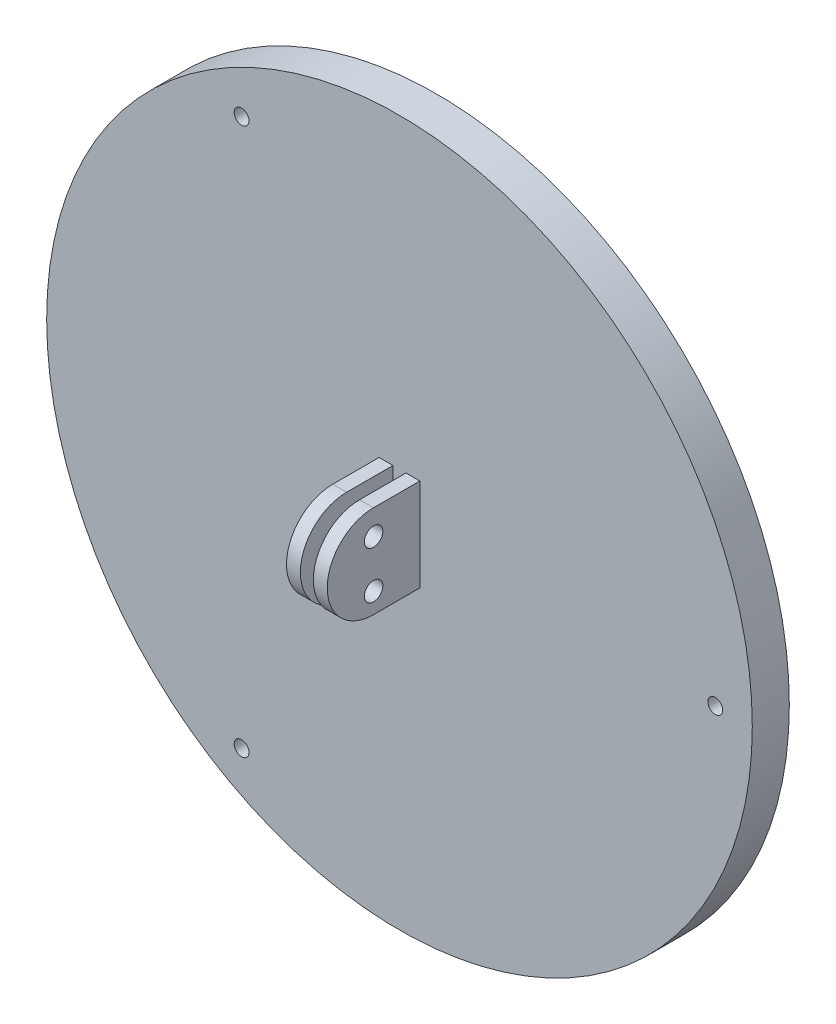
ISO-10303-21;
HEADER;
FILE_DESCRIPTION(('STEP AP214'),'2;1');
FILE_NAME('part.step','',(''),(''),'','','');
FILE_SCHEMA(('AUTOMOTIVE_DESIGN { 1 0 10303 214 1 1 1 1 }'));
ENDSEC;
DATA;
#1=APPLICATION_CONTEXT('core data for automotive mechanical design processes');
#2=APPLICATION_PROTOCOL_DEFINITION('international standard','automotive_design',2000,#1);
#3=PRODUCT_CONTEXT('',#1,'mechanical');
#4=PRODUCT('Part','Part','',(#3));
#5=PRODUCT_RELATED_PRODUCT_CATEGORY('part','',(#4));
#6=PRODUCT_DEFINITION_FORMATION('','',#4);
#7=PRODUCT_DEFINITION_CONTEXT('part definition',#1,'design');
#8=PRODUCT_DEFINITION('design','',#6,#7);
#9=PRODUCT_DEFINITION_SHAPE('','',#8);
#10=(LENGTH_UNIT() NAMED_UNIT(*) SI_UNIT(.MILLI.,.METRE.));
#11=(NAMED_UNIT(*) PLANE_ANGLE_UNIT() SI_UNIT($,.RADIAN.));
#12=(NAMED_UNIT(*) SI_UNIT($,.STERADIAN.) SOLID_ANGLE_UNIT());
#13=UNCERTAINTY_MEASURE_WITH_UNIT(LENGTH_MEASURE(1.E-05),#10,'distance_accuracy_value','');
#14=(GEOMETRIC_REPRESENTATION_CONTEXT(3) GLOBAL_UNCERTAINTY_ASSIGNED_CONTEXT((#13)) GLOBAL_UNIT_ASSIGNED_CONTEXT((#10,
#11,#12)) REPRESENTATION_CONTEXT('',''));
#15=CARTESIAN_POINT('',(0.,0.,0.));
#16=DIRECTION('',(0.,0.,1.));
#17=DIRECTION('',(1.,0.,0.));
#18=AXIS2_PLACEMENT_3D('',#15,#16,#17);
#19=CARTESIAN_POINT('',(0.699999999999999,5.,14.));
#20=DIRECTION('',(1.,0.,0.));
#21=DIRECTION('',(0.,1.,0.));
#22=AXIS2_PLACEMENT_3D('',#19,#20,#21);
#23=PLANE('',#22);
#24=CARTESIAN_POINT('',(0.699999999999999,2.3,9.));
#25=DIRECTION('',(1.,0.,0.));
#26=DIRECTION('',(0.,1.,0.));
#27=AXIS2_PLACEMENT_3D('',#24,#25,#26);
#28=CIRCLE('',#27,1.);
#29=CARTESIAN_POINT('',(0.699999999999999,3.3,9.));
#30=VERTEX_POINT('',#29);
#31=EDGE_CURVE('E127',#30,#30,#28,.T.);
#32=ORIENTED_EDGE('',*,*,#31,.T.);
#33=EDGE_LOOP('',(#32));
#34=FACE_BOUND('',#33,.T.);
#35=CARTESIAN_POINT('',(0.699999999999999,-2.8,9.));
#36=DIRECTION('',(1.,0.,0.));
#37=DIRECTION('',(0.,1.,0.));
#38=AXIS2_PLACEMENT_3D('',#35,#36,#37);
#39=CIRCLE('',#38,1.);
#40=CARTESIAN_POINT('',(0.699999999999999,-1.8,9.));
#41=VERTEX_POINT('',#40);
#42=EDGE_CURVE('E172',#41,#41,#39,.T.);
#43=ORIENTED_EDGE('',*,*,#42,.T.);
#44=EDGE_LOOP('',(#43));
#45=FACE_BOUND('',#44,.T.);
#46=DIRECTION('',(0.,0.,-1.));
#47=VECTOR('',#46,1.);
#48=CARTESIAN_POINT('',(0.7,-5.,14.));
#49=LINE('',#48,#47);
#50=CARTESIAN_POINT('',(0.699999999999999,-5.,9.));
#51=VERTEX_POINT('',#50);
#52=CARTESIAN_POINT('',(0.7,-5.,4.));
#53=VERTEX_POINT('',#52);
#54=EDGE_CURVE('E133',#51,#53,#49,.T.);
#55=ORIENTED_EDGE('',*,*,#54,.F.);
#56=CARTESIAN_POINT('',(0.699999999999999,0.,9.));
#57=DIRECTION('',(1.,0.,0.));
#58=DIRECTION('',(0.,1.,0.));
#59=AXIS2_PLACEMENT_3D('',#56,#57,#58);
#60=CIRCLE('',#59,5.);
#61=CARTESIAN_POINT('',(0.699999999999999,5.,9.));
#62=VERTEX_POINT('',#61);
#63=EDGE_CURVE('E124',#51,#62,#60,.F.);
#64=ORIENTED_EDGE('',*,*,#63,.T.);
#65=DIRECTION('',(0.,0.,-1.));
#66=VECTOR('',#65,1.);
#67=CARTESIAN_POINT('',(0.699999999999999,5.,14.));
#68=LINE('',#67,#66);
#69=CARTESIAN_POINT('',(0.699999999999999,5.,4.));
#70=VERTEX_POINT('',#69);
#71=EDGE_CURVE('E137',#62,#70,#68,.T.);
#72=ORIENTED_EDGE('',*,*,#71,.T.);
#73=DIRECTION('',(0.,-1.,0.));
#74=VECTOR('',#73,1.);
#75=CARTESIAN_POINT('',(0.699999999999999,5.,4.));
#76=LINE('',#75,#74);
#77=EDGE_CURVE('E214',#70,#53,#76,.T.);
#78=ORIENTED_EDGE('',*,*,#77,.T.);
#79=EDGE_LOOP('',(#55,#64,#72,#78));
#80=FACE_BOUND('',#79,.T.);
#81=ADVANCED_FACE('F41',(#34,#45,#80),#23,.F.);
#82=CARTESIAN_POINT('',(2.2,5.,14.));
#83=DIRECTION('',(-1.,0.,0.));
#84=DIRECTION('',(0.,0.,1.));
#85=AXIS2_PLACEMENT_3D('',#82,#83,#84);
#86=PLANE('',#85);
#87=CARTESIAN_POINT('',(2.2,2.3,9.));
#88=DIRECTION('',(1.,0.,0.));
#89=DIRECTION('',(0.,1.,0.));
#90=AXIS2_PLACEMENT_3D('',#87,#88,#89);
#91=CIRCLE('',#90,1.);
#92=CARTESIAN_POINT('',(2.2,3.3,9.));
#93=VERTEX_POINT('',#92);
#94=EDGE_CURVE('E168',#93,#93,#91,.T.);
#95=ORIENTED_EDGE('',*,*,#94,.F.);
#96=EDGE_LOOP('',(#95));
#97=FACE_BOUND('',#96,.T.);
#98=CARTESIAN_POINT('',(2.2,-2.8,9.));
#99=DIRECTION('',(1.,0.,0.));
#100=DIRECTION('',(0.,1.,0.));
#101=AXIS2_PLACEMENT_3D('',#98,#99,#100);
#102=CIRCLE('',#101,1.);
#103=CARTESIAN_POINT('',(2.2,-1.8,9.));
#104=VERTEX_POINT('',#103);
#105=EDGE_CURVE('E175',#104,#104,#102,.T.);
#106=ORIENTED_EDGE('',*,*,#105,.F.);
#107=EDGE_LOOP('',(#106));
#108=FACE_BOUND('',#107,.T.);
#109=CARTESIAN_POINT('',(2.2,0.,9.));
#110=DIRECTION('',(1.,0.,0.));
#111=DIRECTION('',(0.,1.,0.));
#112=AXIS2_PLACEMENT_3D('',#109,#110,#111);
#113=CIRCLE('',#112,5.);
#114=CARTESIAN_POINT('',(2.2,-5.,9.));
#115=VERTEX_POINT('',#114);
#116=CARTESIAN_POINT('',(2.2,5.,9.));
#117=VERTEX_POINT('',#116);
#118=EDGE_CURVE('E110',#115,#117,#113,.F.);
#119=ORIENTED_EDGE('',*,*,#118,.F.);
#120=DIRECTION('',(0.,0.,-1.));
#121=VECTOR('',#120,1.);
#122=CARTESIAN_POINT('',(2.2,-5.,14.));
#123=LINE('',#122,#121);
#124=CARTESIAN_POINT('',(2.2,-5.,4.));
#125=VERTEX_POINT('',#124);
#126=EDGE_CURVE('E114',#115,#125,#123,.T.);
#127=ORIENTED_EDGE('',*,*,#126,.T.);
#128=DIRECTION('',(0.,1.,0.));
#129=VECTOR('',#128,1.);
#130=CARTESIAN_POINT('',(2.2,5.,4.));
#131=LINE('',#130,#129);
#132=CARTESIAN_POINT('',(2.2,5.,4.));
#133=VERTEX_POINT('',#132);
#134=EDGE_CURVE('E218',#125,#133,#131,.T.);
#135=ORIENTED_EDGE('',*,*,#134,.T.);
#136=DIRECTION('',(0.,0.,-1.));
#137=VECTOR('',#136,1.);
#138=CARTESIAN_POINT('',(2.2,5.,14.));
#139=LINE('',#138,#137);
#140=EDGE_CURVE('E66',#117,#133,#139,.T.);
#141=ORIENTED_EDGE('',*,*,#140,.F.);
#142=EDGE_LOOP('',(#119,#127,#135,#141));
#143=FACE_BOUND('',#142,.T.);
#144=ADVANCED_FACE('F112',(#97,#108,#143),#86,.F.);
#145=CARTESIAN_POINT('',(-0.700000000000001,5.,14.));
#146=DIRECTION('',(-1.,0.,0.));
#147=DIRECTION('',(0.,-1.,0.));
#148=AXIS2_PLACEMENT_3D('',#145,#146,#147);
#149=PLANE('',#148);
#150=CARTESIAN_POINT('',(-0.699999999999999,2.3,9.));
#151=DIRECTION('',(-1.,0.,0.));
#152=DIRECTION('',(0.,-1.,0.));
#153=AXIS2_PLACEMENT_3D('',#150,#151,#152);
#154=CIRCLE('',#153,1.);
#155=CARTESIAN_POINT('',(-0.699999999999999,1.3,9.));
#156=VERTEX_POINT('',#155);
#157=EDGE_CURVE('E184',#156,#156,#154,.T.);
#158=ORIENTED_EDGE('',*,*,#157,.T.);
#159=EDGE_LOOP('',(#158));
#160=FACE_BOUND('',#159,.T.);
#161=CARTESIAN_POINT('',(-0.699999999999999,-2.8,9.));
#162=DIRECTION('',(-1.,0.,0.));
#163=DIRECTION('',(0.,-1.,0.));
#164=AXIS2_PLACEMENT_3D('',#161,#162,#163);
#165=CIRCLE('',#164,1.);
#166=CARTESIAN_POINT('',(-0.699999999999999,-3.8,9.));
#167=VERTEX_POINT('',#166);
#168=EDGE_CURVE('E167',#167,#167,#165,.T.);
#169=ORIENTED_EDGE('',*,*,#168,.T.);
#170=EDGE_LOOP('',(#169));
#171=FACE_BOUND('',#170,.T.);
#172=CARTESIAN_POINT('',(-0.699999999999999,0.,9.));
#173=DIRECTION('',(-1.,0.,0.));
#174=DIRECTION('',(0.,-1.,0.));
#175=AXIS2_PLACEMENT_3D('',#172,#173,#174);
#176=CIRCLE('',#175,5.);
#177=CARTESIAN_POINT('',(-0.699999999999999,5.,9.));
#178=VERTEX_POINT('',#177);
#179=CARTESIAN_POINT('',(-0.699999999999999,-5.,9.));
#180=VERTEX_POINT('',#179);
#181=EDGE_CURVE('E194',#178,#180,#176,.F.);
#182=ORIENTED_EDGE('',*,*,#181,.T.);
#183=DIRECTION('',(0.,0.,-1.));
#184=VECTOR('',#183,1.);
#185=CARTESIAN_POINT('',(-0.7,-5.,14.));
#186=LINE('',#185,#184);
#187=CARTESIAN_POINT('',(-0.7,-5.,4.));
#188=VERTEX_POINT('',#187);
#189=EDGE_CURVE('E202',#180,#188,#186,.T.);
#190=ORIENTED_EDGE('',*,*,#189,.T.);
#191=DIRECTION('',(0.,1.,0.));
#192=VECTOR('',#191,1.);
#193=CARTESIAN_POINT('',(-0.700000000000001,5.,4.));
#194=LINE('',#193,#192);
#195=CARTESIAN_POINT('',(-0.700000000000001,5.,4.));
#196=VERTEX_POINT('',#195);
#197=EDGE_CURVE('E211',#188,#196,#194,.T.);
#198=ORIENTED_EDGE('',*,*,#197,.T.);
#199=DIRECTION('',(0.,0.,-1.));
#200=VECTOR('',#199,1.);
#201=CARTESIAN_POINT('',(-0.700000000000001,5.,14.));
#202=LINE('',#201,#200);
#203=EDGE_CURVE('E197',#178,#196,#202,.T.);
#204=ORIENTED_EDGE('',*,*,#203,.F.);
#205=EDGE_LOOP('',(#182,#190,#198,#204));
#206=FACE_BOUND('',#205,.T.);
#207=ADVANCED_FACE('F242',(#160,#171,#206),#149,.F.);
#208=CARTESIAN_POINT('',(-2.2,5.,14.));
#209=DIRECTION('',(1.,0.,0.));
#210=DIRECTION('',(0.,1.,0.));
#211=AXIS2_PLACEMENT_3D('',#208,#209,#210);
#212=PLANE('',#211);
#213=CARTESIAN_POINT('',(-2.2,2.3,9.));
#214=DIRECTION('',(1.,0.,0.));
#215=DIRECTION('',(0.,1.,0.));
#216=AXIS2_PLACEMENT_3D('',#213,#214,#215);
#217=CIRCLE('',#216,1.);
#218=CARTESIAN_POINT('',(-2.2,3.3,9.));
#219=VERTEX_POINT('',#218);
#220=EDGE_CURVE('E45',#219,#219,#217,.T.);
#221=ORIENTED_EDGE('',*,*,#220,.T.);
#222=EDGE_LOOP('',(#221));
#223=FACE_BOUND('',#222,.T.);
#224=CARTESIAN_POINT('',(-2.2,-2.8,9.));
#225=DIRECTION('',(1.,0.,0.));
#226=DIRECTION('',(0.,1.,0.));
#227=AXIS2_PLACEMENT_3D('',#224,#225,#226);
#228=CIRCLE('',#227,1.);
#229=CARTESIAN_POINT('',(-2.2,-1.8,9.));
#230=VERTEX_POINT('',#229);
#231=EDGE_CURVE('E165',#230,#230,#228,.T.);
#232=ORIENTED_EDGE('',*,*,#231,.T.);
#233=EDGE_LOOP('',(#232));
#234=FACE_BOUND('',#233,.T.);
#235=DIRECTION('',(0.,0.,-1.));
#236=VECTOR('',#235,1.);
#237=CARTESIAN_POINT('',(-2.2,-5.,14.));
#238=LINE('',#237,#236);
#239=CARTESIAN_POINT('',(-2.2,-5.,9.));
#240=VERTEX_POINT('',#239);
#241=CARTESIAN_POINT('',(-2.2,-5.,4.));
#242=VERTEX_POINT('',#241);
#243=EDGE_CURVE('E58',#240,#242,#238,.T.);
#244=ORIENTED_EDGE('',*,*,#243,.F.);
#245=CARTESIAN_POINT('',(-2.2,0.,9.));
#246=DIRECTION('',(1.,0.,0.));
#247=DIRECTION('',(0.,1.,0.));
#248=AXIS2_PLACEMENT_3D('',#245,#246,#247);
#249=CIRCLE('',#248,5.);
#250=CARTESIAN_POINT('',(-2.2,5.,9.));
#251=VERTEX_POINT('',#250);
#252=EDGE_CURVE('E191',#240,#251,#249,.F.);
#253=ORIENTED_EDGE('',*,*,#252,.T.);
#254=DIRECTION('',(0.,0.,-1.));
#255=VECTOR('',#254,1.);
#256=CARTESIAN_POINT('',(-2.2,5.,14.));
#257=LINE('',#256,#255);
#258=CARTESIAN_POINT('',(-2.2,5.,4.));
#259=VERTEX_POINT('',#258);
#260=EDGE_CURVE('E199',#251,#259,#257,.T.);
#261=ORIENTED_EDGE('',*,*,#260,.T.);
#262=DIRECTION('',(0.,-1.,0.));
#263=VECTOR('',#262,1.);
#264=CARTESIAN_POINT('',(-2.2,5.,4.));
#265=LINE('',#264,#263);
#266=EDGE_CURVE('E206',#259,#242,#265,.T.);
#267=ORIENTED_EDGE('',*,*,#266,.T.);
#268=EDGE_LOOP('',(#244,#253,#261,#267));
#269=FACE_BOUND('',#268,.T.);
#270=ADVANCED_FACE('F327',(#223,#234,#269),#212,.F.);
#271=CARTESIAN_POINT('',(0.699999999999999,5.,14.));
#272=DIRECTION('',(0.,-1.,0.));
#273=DIRECTION('',(0.,0.,-1.));
#274=AXIS2_PLACEMENT_3D('',#271,#272,#273);
#275=PLANE('',#274);
#276=DIRECTION('',(1.,0.,0.));
#277=VECTOR('',#276,1.);
#278=CARTESIAN_POINT('',(-38.1,4.99999999999999,9.));
#279=LINE('',#278,#277);
#280=EDGE_CURVE('E117',#62,#117,#279,.T.);
#281=ORIENTED_EDGE('',*,*,#280,.T.);
#282=ORIENTED_EDGE('',*,*,#140,.T.);
#283=DIRECTION('',(-1.,0.,0.));
#284=VECTOR('',#283,1.);
#285=CARTESIAN_POINT('',(0.699999999999999,5.,4.));
#286=LINE('',#285,#284);
#287=EDGE_CURVE('E220',#133,#70,#286,.T.);
#288=ORIENTED_EDGE('',*,*,#287,.T.);
#289=ORIENTED_EDGE('',*,*,#71,.F.);
#290=EDGE_LOOP('',(#281,#282,#288,#289));
#291=FACE_BOUND('',#290,.T.);
#292=ADVANCED_FACE('F225',(#291),#275,.F.);
#293=CARTESIAN_POINT('',(-0.700000000000001,5.,14.));
#294=DIRECTION('',(0.,-1.,0.));
#295=DIRECTION('',(0.,0.,-1.));
#296=AXIS2_PLACEMENT_3D('',#293,#294,#295);
#297=PLANE('',#296);
#298=EDGE_CURVE('E190',#251,#178,#279,.T.);
#299=ORIENTED_EDGE('',*,*,#298,.T.);
#300=ORIENTED_EDGE('',*,*,#203,.T.);
#301=DIRECTION('',(-1.,0.,0.));
#302=VECTOR('',#301,1.);
#303=CARTESIAN_POINT('',(-0.700000000000001,5.,4.));
#304=LINE('',#303,#302);
#305=EDGE_CURVE('E208',#196,#259,#304,.T.);
#306=ORIENTED_EDGE('',*,*,#305,.T.);
#307=ORIENTED_EDGE('',*,*,#260,.F.);
#308=EDGE_LOOP('',(#299,#300,#306,#307));
#309=FACE_BOUND('',#308,.T.);
#310=ADVANCED_FACE('F230',(#309),#297,.F.);
#311=CARTESIAN_POINT('',(0.,0.,4.));
#312=DIRECTION('',(0.,0.,1.));
#313=DIRECTION('',(1.,0.,0.));
#314=AXIS2_PLACEMENT_3D('',#311,#312,#313);
#315=PLANE('',#314);
#316=CARTESIAN_POINT('',(0.,0.,4.));
#317=DIRECTION('',(0.,0.,1.));
#318=DIRECTION('',(1.,0.,0.));
#319=AXIS2_PLACEMENT_3D('',#316,#317,#318);
#320=CIRCLE('',#319,0.6);
#321=CARTESIAN_POINT('',(0.6,0.,4.));
#322=VERTEX_POINT('',#321);
#323=EDGE_CURVE('E135',#322,#322,#320,.T.);
#324=ORIENTED_EDGE('',*,*,#323,.F.);
#325=EDGE_LOOP('',(#324));
#326=FACE_BOUND('',#325,.T.);
#327=CARTESIAN_POINT('',(34.1000000000013,-0.0857218150126376,4.));
#328=DIRECTION('',(0.,0.,1.));
#329=DIRECTION('',(1.,0.,0.));
#330=AXIS2_PLACEMENT_3D('',#327,#328,#329);
#331=CIRCLE('',#330,0.800000000000003);
#332=CARTESIAN_POINT('',(34.9000000000013,-0.0857218150126376,4.));
#333=VERTEX_POINT('',#332);
#334=EDGE_CURVE('E144',#333,#333,#331,.T.);
#335=ORIENTED_EDGE('',*,*,#334,.F.);
#336=EDGE_LOOP('',(#335));
#337=FACE_BOUND('',#336,.T.);
#338=CARTESIAN_POINT('',(-17.0499999999986,-29.617188084062,4.));
#339=DIRECTION('',(0.,0.,1.));
#340=DIRECTION('',(1.,0.,0.));
#341=AXIS2_PLACEMENT_3D('',#338,#339,#340);
#342=CIRCLE('',#341,0.799999999999999);
#343=CARTESIAN_POINT('',(-16.2499999999986,-29.617188084062,4.));
#344=VERTEX_POINT('',#343);
#345=EDGE_CURVE('E148',#344,#344,#342,.T.);
#346=ORIENTED_EDGE('',*,*,#345,.F.);
#347=EDGE_LOOP('',(#346));
#348=FACE_BOUND('',#347,.T.);
#349=CARTESIAN_POINT('',(-17.0499999999987,29.4457444540367,4.));
#350=DIRECTION('',(0.,0.,1.));
#351=DIRECTION('',(1.,0.,0.));
#352=AXIS2_PLACEMENT_3D('',#349,#350,#351);
#353=CIRCLE('',#352,0.799999999999999);
#354=CARTESIAN_POINT('',(-16.2499999999986,29.4457444540367,4.));
#355=VERTEX_POINT('',#354);
#356=EDGE_CURVE('E151',#355,#355,#353,.T.);
#357=ORIENTED_EDGE('',*,*,#356,.F.);
#358=EDGE_LOOP('',(#357));
#359=FACE_BOUND('',#358,.T.);
#360=CARTESIAN_POINT('',(0.,0.,4.));
#361=DIRECTION('',(0.,0.,1.));
#362=DIRECTION('',(1.,0.,0.));
#363=AXIS2_PLACEMENT_3D('',#360,#361,#362);
#364=CIRCLE('',#363,38.1);
#365=CARTESIAN_POINT('',(38.1,0.,4.));
#366=VERTEX_POINT('',#365);
#367=EDGE_CURVE('E11',#366,#366,#364,.T.);
#368=ORIENTED_EDGE('',*,*,#367,.T.);
#369=EDGE_LOOP('',(#368));
#370=FACE_BOUND('',#369,.T.);
#371=DIRECTION('',(1.,0.,0.));
#372=VECTOR('',#371,1.);
#373=CARTESIAN_POINT('',(0.7,-5.,4.));
#374=LINE('',#373,#372);
#375=EDGE_CURVE('E131',#53,#125,#374,.T.);
#376=ORIENTED_EDGE('',*,*,#375,.F.);
#377=ORIENTED_EDGE('',*,*,#77,.F.);
#378=ORIENTED_EDGE('',*,*,#287,.F.);
#379=ORIENTED_EDGE('',*,*,#134,.F.);
#380=EDGE_LOOP('',(#376,#377,#378,#379));
#381=FACE_BOUND('',#380,.T.);
#382=ORIENTED_EDGE('',*,*,#305,.F.);
#383=ORIENTED_EDGE('',*,*,#197,.F.);
#384=DIRECTION('',(1.,0.,0.));
#385=VECTOR('',#384,1.);
#386=CARTESIAN_POINT('',(-0.7,-5.,4.));
#387=LINE('',#386,#385);
#388=EDGE_CURVE('E204',#242,#188,#387,.T.);
#389=ORIENTED_EDGE('',*,*,#388,.F.);
#390=ORIENTED_EDGE('',*,*,#266,.F.);
#391=EDGE_LOOP('',(#382,#383,#389,#390));
#392=FACE_BOUND('',#391,.T.);
#393=ADVANCED_FACE('F227',(#326,#337,#348,#359,#370,#381,#392),#315,.T.);
#394=CARTESIAN_POINT('',(0.,0.,4.));
#395=DIRECTION('',(0.,0.,-1.));
#396=DIRECTION('',(-1.,0.,0.));
#397=AXIS2_PLACEMENT_3D('',#394,#395,#396);
#398=CYLINDRICAL_SURFACE('',#397,38.1);
#399=ORIENTED_EDGE('',*,*,#367,.F.);
#400=EDGE_LOOP('',(#399));
#401=FACE_BOUND('',#400,.T.);
#402=CARTESIAN_POINT('',(0.,0.,0.));
#403=DIRECTION('',(0.,0.,1.));
#404=DIRECTION('',(1.,0.,0.));
#405=AXIS2_PLACEMENT_3D('',#402,#403,#404);
#406=CIRCLE('',#405,38.1);
#407=CARTESIAN_POINT('',(38.1,0.,0.));
#408=VERTEX_POINT('',#407);
#409=EDGE_CURVE('E50',#408,#408,#406,.T.);
#410=ORIENTED_EDGE('',*,*,#409,.T.);
#411=EDGE_LOOP('',(#410));
#412=FACE_BOUND('',#411,.T.);
#413=ADVANCED_FACE('F43',(#401,#412),#398,.T.);
#414=CARTESIAN_POINT('',(0.,0.,0.));
#415=DIRECTION('',(0.,0.,1.));
#416=DIRECTION('',(1.,0.,0.));
#417=AXIS2_PLACEMENT_3D('',#414,#415,#416);
#418=PLANE('',#417);
#419=CARTESIAN_POINT('',(0.,0.,0.));
#420=DIRECTION('',(0.,0.,1.));
#421=DIRECTION('',(1.,0.,0.));
#422=AXIS2_PLACEMENT_3D('',#419,#420,#421);
#423=CIRCLE('',#422,0.6);
#424=CARTESIAN_POINT('',(0.6,0.,0.));
#425=VERTEX_POINT('',#424);
#426=EDGE_CURVE('E143',#425,#425,#423,.T.);
#427=ORIENTED_EDGE('',*,*,#426,.T.);
#428=EDGE_LOOP('',(#427));
#429=FACE_BOUND('',#428,.T.);
#430=CARTESIAN_POINT('',(34.1000000000013,-0.0857218150126376,0.));
#431=DIRECTION('',(0.,0.,1.));
#432=DIRECTION('',(1.,0.,0.));
#433=AXIS2_PLACEMENT_3D('',#430,#431,#432);
#434=CIRCLE('',#433,0.800000000000003);
#435=CARTESIAN_POINT('',(34.9000000000013,-0.0857218150126376,0.));
#436=VERTEX_POINT('',#435);
#437=EDGE_CURVE('E156',#436,#436,#434,.T.);
#438=ORIENTED_EDGE('',*,*,#437,.T.);
#439=EDGE_LOOP('',(#438));
#440=FACE_BOUND('',#439,.T.);
#441=CARTESIAN_POINT('',(-17.0499999999986,-29.617188084062,0.));
#442=DIRECTION('',(0.,0.,1.));
#443=DIRECTION('',(1.,0.,0.));
#444=AXIS2_PLACEMENT_3D('',#441,#442,#443);
#445=CIRCLE('',#444,0.799999999999999);
#446=CARTESIAN_POINT('',(-16.2499999999986,-29.617188084062,0.));
#447=VERTEX_POINT('',#446);
#448=EDGE_CURVE('E159',#447,#447,#445,.T.);
#449=ORIENTED_EDGE('',*,*,#448,.T.);
#450=EDGE_LOOP('',(#449));
#451=FACE_BOUND('',#450,.T.);
#452=CARTESIAN_POINT('',(-17.0499999999987,29.4457444540367,0.));
#453=DIRECTION('',(0.,0.,1.));
#454=DIRECTION('',(1.,0.,0.));
#455=AXIS2_PLACEMENT_3D('',#452,#453,#454);
#456=CIRCLE('',#455,0.799999999999999);
#457=CARTESIAN_POINT('',(-16.2499999999986,29.4457444540367,0.));
#458=VERTEX_POINT('',#457);
#459=EDGE_CURVE('E147',#458,#458,#456,.T.);
#460=ORIENTED_EDGE('',*,*,#459,.T.);
#461=EDGE_LOOP('',(#460));
#462=FACE_BOUND('',#461,.T.);
#463=ORIENTED_EDGE('',*,*,#409,.F.);
#464=EDGE_LOOP('',(#463));
#465=FACE_BOUND('',#464,.T.);
#466=ADVANCED_FACE('F282',(#429,#440,#451,#462,#465),#418,.F.);
#467=CARTESIAN_POINT('',(-17.0499999999987,29.4457444540367,-2.));
#468=DIRECTION('',(0.,0.,1.));
#469=DIRECTION('',(1.,0.,0.));
#470=AXIS2_PLACEMENT_3D('',#467,#468,#469);
#471=CYLINDRICAL_SURFACE('',#470,0.799999999999999);
#472=ORIENTED_EDGE('',*,*,#356,.T.);
#473=EDGE_LOOP('',(#472));
#474=FACE_BOUND('',#473,.T.);
#475=ORIENTED_EDGE('',*,*,#459,.F.);
#476=EDGE_LOOP('',(#475));
#477=FACE_BOUND('',#476,.T.);
#478=ADVANCED_FACE('F279',(#474,#477),#471,.F.);
#479=CARTESIAN_POINT('',(-17.0499999999986,-29.617188084062,-2.));
#480=DIRECTION('',(0.,0.,1.));
#481=DIRECTION('',(1.,0.,0.));
#482=AXIS2_PLACEMENT_3D('',#479,#480,#481);
#483=CYLINDRICAL_SURFACE('',#482,0.799999999999999);
#484=ORIENTED_EDGE('',*,*,#345,.T.);
#485=EDGE_LOOP('',(#484));
#486=FACE_BOUND('',#485,.T.);
#487=ORIENTED_EDGE('',*,*,#448,.F.);
#488=EDGE_LOOP('',(#487));
#489=FACE_BOUND('',#488,.T.);
#490=ADVANCED_FACE('F275',(#486,#489),#483,.F.);
#491=CARTESIAN_POINT('',(34.1000000000013,-0.0857218150126376,-2.));
#492=DIRECTION('',(0.,0.,1.));
#493=DIRECTION('',(1.,0.,0.));
#494=AXIS2_PLACEMENT_3D('',#491,#492,#493);
#495=CYLINDRICAL_SURFACE('',#494,0.800000000000003);
#496=ORIENTED_EDGE('',*,*,#334,.T.);
#497=EDGE_LOOP('',(#496));
#498=FACE_BOUND('',#497,.T.);
#499=ORIENTED_EDGE('',*,*,#437,.F.);
#500=EDGE_LOOP('',(#499));
#501=FACE_BOUND('',#500,.T.);
#502=ADVANCED_FACE('F271',(#498,#501),#495,.F.);
#503=CARTESIAN_POINT('',(0.,0.,-2.));
#504=DIRECTION('',(0.,0.,1.));
#505=DIRECTION('',(1.,0.,0.));
#506=AXIS2_PLACEMENT_3D('',#503,#504,#505);
#507=CYLINDRICAL_SURFACE('',#506,0.6);
#508=ORIENTED_EDGE('',*,*,#323,.T.);
#509=EDGE_LOOP('',(#508));
#510=FACE_BOUND('',#509,.T.);
#511=ORIENTED_EDGE('',*,*,#426,.F.);
#512=EDGE_LOOP('',(#511));
#513=FACE_BOUND('',#512,.T.);
#514=ADVANCED_FACE('F255',(#510,#513),#507,.F.);
#515=CARTESIAN_POINT('',(0.7,-5.,14.));
#516=DIRECTION('',(0.,1.,0.));
#517=DIRECTION('',(-1.,0.,0.));
#518=AXIS2_PLACEMENT_3D('',#515,#516,#517);
#519=PLANE('',#518);
#520=ORIENTED_EDGE('',*,*,#126,.F.);
#521=DIRECTION('',(1.,0.,0.));
#522=VECTOR('',#521,1.);
#523=CARTESIAN_POINT('',(-38.1,-5.00000000000001,9.));
#524=LINE('',#523,#522);
#525=EDGE_CURVE('E121',#51,#115,#524,.T.);
#526=ORIENTED_EDGE('',*,*,#525,.F.);
#527=ORIENTED_EDGE('',*,*,#54,.T.);
#528=ORIENTED_EDGE('',*,*,#375,.T.);
#529=EDGE_LOOP('',(#520,#526,#527,#528));
#530=FACE_BOUND('',#529,.T.);
#531=ADVANCED_FACE('F129',(#530),#519,.F.);
#532=CARTESIAN_POINT('',(-0.7,-5.,14.));
#533=DIRECTION('',(0.,1.,0.));
#534=DIRECTION('',(0.,0.,1.));
#535=AXIS2_PLACEMENT_3D('',#532,#533,#534);
#536=PLANE('',#535);
#537=ORIENTED_EDGE('',*,*,#189,.F.);
#538=EDGE_CURVE('E118',#240,#180,#524,.T.);
#539=ORIENTED_EDGE('',*,*,#538,.F.);
#540=ORIENTED_EDGE('',*,*,#243,.T.);
#541=ORIENTED_EDGE('',*,*,#388,.T.);
#542=EDGE_LOOP('',(#537,#539,#540,#541));
#543=FACE_BOUND('',#542,.T.);
#544=ADVANCED_FACE('F245',(#543),#536,.F.);
#545=CARTESIAN_POINT('',(-38.1,0.,9.));
#546=DIRECTION('',(1.,0.,0.));
#547=DIRECTION('',(0.,1.,0.));
#548=AXIS2_PLACEMENT_3D('',#545,#546,#547);
#549=CYLINDRICAL_SURFACE('',#548,5.);
#550=ORIENTED_EDGE('',*,*,#298,.F.);
#551=ORIENTED_EDGE('',*,*,#252,.F.);
#552=ORIENTED_EDGE('',*,*,#538,.T.);
#553=ORIENTED_EDGE('',*,*,#181,.F.);
#554=EDGE_LOOP('',(#550,#551,#552,#553));
#555=FACE_BOUND('',#554,.T.);
#556=ADVANCED_FACE('F247',(#555),#549,.T.);
#557=ORIENTED_EDGE('',*,*,#63,.F.);
#558=ORIENTED_EDGE('',*,*,#525,.T.);
#559=ORIENTED_EDGE('',*,*,#118,.T.);
#560=ORIENTED_EDGE('',*,*,#280,.F.);
#561=EDGE_LOOP('',(#557,#558,#559,#560));
#562=FACE_BOUND('',#561,.T.);
#563=ADVANCED_FACE('F122',(#562),#549,.T.);
#564=CARTESIAN_POINT('',(-38.1,-2.80000000000001,9.));
#565=DIRECTION('',(1.,0.,0.));
#566=DIRECTION('',(0.,1.,0.));
#567=AXIS2_PLACEMENT_3D('',#564,#565,#566);
#568=CYLINDRICAL_SURFACE('',#567,1.);
#569=ORIENTED_EDGE('',*,*,#231,.F.);
#570=EDGE_LOOP('',(#569));
#571=FACE_BOUND('',#570,.T.);
#572=ORIENTED_EDGE('',*,*,#168,.F.);
#573=EDGE_LOOP('',(#572));
#574=FACE_BOUND('',#573,.T.);
#575=ADVANCED_FACE('F361',(#571,#574),#568,.F.);
#576=CARTESIAN_POINT('',(-38.1,2.29999999999999,9.));
#577=DIRECTION('',(1.,0.,0.));
#578=DIRECTION('',(0.,1.,0.));
#579=AXIS2_PLACEMENT_3D('',#576,#577,#578);
#580=CYLINDRICAL_SURFACE('',#579,1.);
#581=ORIENTED_EDGE('',*,*,#220,.F.);
#582=EDGE_LOOP('',(#581));
#583=FACE_BOUND('',#582,.T.);
#584=ORIENTED_EDGE('',*,*,#157,.F.);
#585=EDGE_LOOP('',(#584));
#586=FACE_BOUND('',#585,.T.);
#587=ADVANCED_FACE('F453',(#583,#586),#580,.F.);
#588=ORIENTED_EDGE('',*,*,#105,.T.);
#589=EDGE_LOOP('',(#588));
#590=FACE_BOUND('',#589,.T.);
#591=ORIENTED_EDGE('',*,*,#42,.F.);
#592=EDGE_LOOP('',(#591));
#593=FACE_BOUND('',#592,.T.);
#594=ADVANCED_FACE('F456',(#590,#593),#568,.F.);
#595=ORIENTED_EDGE('',*,*,#94,.T.);
#596=EDGE_LOOP('',(#595));
#597=FACE_BOUND('',#596,.T.);
#598=ORIENTED_EDGE('',*,*,#31,.F.);
#599=EDGE_LOOP('',(#598));
#600=FACE_BOUND('',#599,.T.);
#601=ADVANCED_FACE('F465',(#597,#600),#580,.F.);
#602=CLOSED_SHELL('',(#81,#144,#207,#270,#292,#310,#393,#413,#466,#478,#490,#502,#514,#531,#544,
#556,#563,#575,#587,#594,#601));
#603=MANIFOLD_SOLID_BREP('B2',#602);
#604=ADVANCED_BREP_SHAPE_REPRESENTATION('',(#18,#603),#14);
#605=SHAPE_DEFINITION_REPRESENTATION(#9,#604);
ENDSEC;
END-ISO-10303-21;
